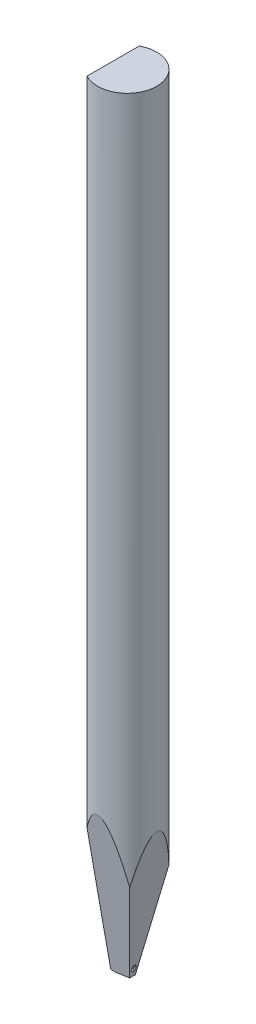
ISO-10303-21;
HEADER;
FILE_DESCRIPTION(('STEP AP214'),'2;1');
FILE_NAME('part.step','',(''),(''),'','','');
FILE_SCHEMA(('AUTOMOTIVE_DESIGN { 1 0 10303 214 1 1 1 1 }'));
ENDSEC;
DATA;
#1=APPLICATION_CONTEXT('core data for automotive mechanical design processes');
#2=APPLICATION_PROTOCOL_DEFINITION('international standard','automotive_design',2000,#1);
#3=PRODUCT_CONTEXT('',#1,'mechanical');
#4=PRODUCT('Part','Part','',(#3));
#5=PRODUCT_RELATED_PRODUCT_CATEGORY('part','',(#4));
#6=PRODUCT_DEFINITION_FORMATION('','',#4);
#7=PRODUCT_DEFINITION_CONTEXT('part definition',#1,'design');
#8=PRODUCT_DEFINITION('design','',#6,#7);
#9=PRODUCT_DEFINITION_SHAPE('','',#8);
#10=(LENGTH_UNIT() NAMED_UNIT(*) SI_UNIT(.MILLI.,.METRE.));
#11=(NAMED_UNIT(*) PLANE_ANGLE_UNIT() SI_UNIT($,.RADIAN.));
#12=(NAMED_UNIT(*) SI_UNIT($,.STERADIAN.) SOLID_ANGLE_UNIT());
#13=UNCERTAINTY_MEASURE_WITH_UNIT(LENGTH_MEASURE(1.E-05),#10,'distance_accuracy_value','');
#14=(GEOMETRIC_REPRESENTATION_CONTEXT(3) GLOBAL_UNCERTAINTY_ASSIGNED_CONTEXT((#13)) GLOBAL_UNIT_ASSIGNED_CONTEXT((#10,
#11,#12)) REPRESENTATION_CONTEXT('',''));
#15=CARTESIAN_POINT('',(0.,0.,0.));
#16=DIRECTION('',(0.,0.,1.));
#17=DIRECTION('',(1.,0.,0.));
#18=AXIS2_PLACEMENT_3D('',#15,#16,#17);
#19=CARTESIAN_POINT('',(26.8738719491216,0.,0.0635));
#20=DIRECTION('',(0.,-0.173648177666931,0.984807753012208));
#21=DIRECTION('',(0.,-0.984807753012208,-0.173648177666931));
#22=AXIS2_PLACEMENT_3D('',#19,#20,#21);
#23=PLANE('',#22);
#24=CARTESIAN_POINT('',(-0.34798,0.02794,0.0684265758409963));
#25=DIRECTION('',(0.,-0.173648177666931,0.984807753012208));
#26=DIRECTION('',(0.,-0.984807753012208,-0.173648177666931));
#27=AXIS2_PLACEMENT_3D('',#24,#25,#26);
#28=ELLIPSE('',#27,0.0283710195360877,0.02794);
#29=CARTESIAN_POINT('',(-0.34798,0.,0.0635000000000018));
#30=VERTEX_POINT('',#29);
#31=CARTESIAN_POINT('',(-0.37592,0.02794,0.0684265758409963));
#32=VERTEX_POINT('',#31);
#33=EDGE_CURVE('E427',#30,#32,#28,.F.);
#34=ORIENTED_EDGE('',*,*,#33,.F.);
#35=DIRECTION('',(-1.,0.,0.));
#36=VECTOR('',#35,1.);
#37=CARTESIAN_POINT('',(26.8738719491216,0.,0.0635));
#38=LINE('',#37,#36);
#39=CARTESIAN_POINT('',(-0.248919999999998,0.,0.0634999999999999));
#40=VERTEX_POINT('',#39);
#41=EDGE_CURVE('E327',#40,#30,#38,.T.);
#42=ORIENTED_EDGE('',*,*,#41,.F.);
#43=DIRECTION('',(-0.984346441568213,-0.173566836012845,-0.0306045161452665));
#44=VECTOR('',#43,1.);
#45=CARTESIAN_POINT('',(26.0313815351658,4.63392622180385,0.880586219516461));
#46=LINE('',#45,#44);
#47=CARTESIAN_POINT('',(0.144305865656663,0.0693363296277129,0.0757258656566614));
#48=VERTEX_POINT('',#47);
#49=EDGE_CURVE('E324',#48,#40,#46,.T.);
#50=ORIENTED_EDGE('',*,*,#49,.F.);
#51=DIRECTION('',(-0.171087869746036,-0.970287525247814,-0.171087869746036));
#52=VECTOR('',#51,1.);
#53=CARTESIAN_POINT('',(0.914840574567862,4.43925581566021,0.846260574567863));
#54=LINE('',#53,#52);
#55=CARTESIAN_POINT('',(0.593607862310868,2.61745457477063,0.525027862310868));
#56=VERTEX_POINT('',#55);
#57=EDGE_CURVE('E321',#56,#48,#54,.T.);
#58=ORIENTED_EDGE('',*,*,#57,.F.);
#59=CARTESIAN_POINT('',(0.,-0.36012639554572,0.));
#60=DIRECTION('',(0.,-0.173648177666931,0.984807753012208));
#61=DIRECTION('',(0.,-0.984807753012208,-0.173648177666931));
#62=AXIS2_PLACEMENT_3D('',#59,#60,#61);
#63=ELLIPSE('',#62,4.56371043248163,0.792479999999998);
#64=CARTESIAN_POINT('',(-0.37592,3.596415651605,0.69764511322018));
#65=VERTEX_POINT('',#64);
#66=EDGE_CURVE('E332',#56,#65,#63,.T.);
#67=ORIENTED_EDGE('',*,*,#66,.T.);
#68=DIRECTION('',(0.,0.984807753012208,0.173648177666931));
#69=VECTOR('',#68,1.);
#70=CARTESIAN_POINT('',(-0.37592,20.2489404246979,3.63393452763258));
#71=LINE('',#70,#69);
#72=EDGE_CURVE('E347',#32,#65,#71,.T.);
#73=ORIENTED_EDGE('',*,*,#72,.F.);
#74=EDGE_LOOP('',(#34,#42,#50,#58,#67,#73));
#75=FACE_BOUND('',#74,.T.);
#76=ADVANCED_FACE('F46',(#75),#23,.T.);
#77=CARTESIAN_POINT('',(26.8738719491216,0.,-0.0635));
#78=DIRECTION('',(0.,-0.173648177666931,-0.984807753012208));
#79=DIRECTION('',(0.,0.984807753012208,-0.173648177666931));
#80=AXIS2_PLACEMENT_3D('',#77,#78,#79);
#81=PLANE('',#80);
#82=CARTESIAN_POINT('',(-0.34798,0.02794,-0.0684265758409928));
#83=DIRECTION('',(0.,-0.173648177666931,-0.984807753012208));
#84=DIRECTION('',(0.,0.984807753012208,-0.173648177666931));
#85=AXIS2_PLACEMENT_3D('',#82,#83,#84);
#86=ELLIPSE('',#85,0.0283710195360877,0.02794);
#87=CARTESIAN_POINT('',(-0.37592,0.02794,-0.0684265758409928));
#88=VERTEX_POINT('',#87);
#89=CARTESIAN_POINT('',(-0.34798,0.,-0.0634999999999983));
#90=VERTEX_POINT('',#89);
#91=EDGE_CURVE('E432',#88,#90,#86,.F.);
#92=ORIENTED_EDGE('',*,*,#91,.F.);
#93=DIRECTION('',(0.,-0.984807753012208,0.173648177666931));
#94=VECTOR('',#93,1.);
#95=CARTESIAN_POINT('',(-0.37592,20.5234047424735,-3.68232999209816));
#96=LINE('',#95,#94);
#97=CARTESIAN_POINT('',(-0.37592,3.596415651605,-0.69764511322018));
#98=VERTEX_POINT('',#97);
#99=EDGE_CURVE('E349',#98,#88,#96,.T.);
#100=ORIENTED_EDGE('',*,*,#99,.F.);
#101=CARTESIAN_POINT('',(0.,-0.36012639554572,0.));
#102=DIRECTION('',(0.,-0.173648177666931,-0.984807753012208));
#103=DIRECTION('',(0.,-0.984807753012208,0.173648177666931));
#104=AXIS2_PLACEMENT_3D('',#101,#102,#103);
#105=ELLIPSE('',#104,4.56371043248163,0.792479999999998);
#106=CARTESIAN_POINT('',(0.593607862310868,2.61745457477063,-0.525027862310868));
#107=VERTEX_POINT('',#106);
#108=EDGE_CURVE('E335',#98,#107,#105,.T.);
#109=ORIENTED_EDGE('',*,*,#108,.T.);
#110=DIRECTION('',(0.171087869746036,0.970287525247814,-0.171087869746036));
#111=VECTOR('',#110,1.);
#112=CARTESIAN_POINT('',(0.914840574567862,4.43925581566021,-0.846260574567863));
#113=LINE('',#112,#111);
#114=CARTESIAN_POINT('',(0.144305865656663,0.0693363296277129,-0.0757258656566614));
#115=VERTEX_POINT('',#114);
#116=EDGE_CURVE('E352',#115,#107,#113,.T.);
#117=ORIENTED_EDGE('',*,*,#116,.F.);
#118=DIRECTION('',(0.984346441568213,0.173566836012845,-0.0306045161452665));
#119=VECTOR('',#118,1.);
#120=CARTESIAN_POINT('',(26.0313815351658,4.63392622180385,-0.880586219516461));
#121=LINE('',#120,#119);
#122=CARTESIAN_POINT('',(-0.248919999999998,0.,-0.0634999999999999));
#123=VERTEX_POINT('',#122);
#124=EDGE_CURVE('E354',#123,#115,#121,.T.);
#125=ORIENTED_EDGE('',*,*,#124,.F.);
#126=DIRECTION('',(-1.,0.,0.));
#127=VECTOR('',#126,1.);
#128=CARTESIAN_POINT('',(26.8738719491216,0.,-0.0635));
#129=LINE('',#128,#127);
#130=EDGE_CURVE('E329',#123,#90,#129,.T.);
#131=ORIENTED_EDGE('',*,*,#130,.T.);
#132=EDGE_LOOP('',(#92,#100,#109,#117,#125,#131));
#133=FACE_BOUND('',#132,.T.);
#134=ADVANCED_FACE('F243',(#133),#81,.T.);
#135=CARTESIAN_POINT('',(26.7151219491216,-0.192529968,0.));
#136=DIRECTION('',(-1.,0.,0.));
#137=DIRECTION('',(0.,0.,1.));
#138=AXIS2_PLACEMENT_3D('',#135,#136,#137);
#139=CYLINDRICAL_SURFACE('',#138,0.19558);
#140=DIRECTION('',(-1.,0.,0.));
#141=VECTOR('',#140,1.);
#142=CARTESIAN_POINT('',(26.7151219491216,0.,0.0344056364847241));
#143=LINE('',#142,#141);
#144=CARTESIAN_POINT('',(-0.24922431076338,0.,0.0344056364847241));
#145=VERTEX_POINT('',#144);
#146=CARTESIAN_POINT('',(-0.347980000000001,0.,0.0344056364847239));
#147=VERTEX_POINT('',#146);
#148=EDGE_CURVE('E208',#145,#147,#143,.T.);
#149=ORIENTED_EDGE('',*,*,#148,.T.);
#150=CARTESIAN_POINT('',(-0.34798,0.,0.0344056364847239));
#151=CARTESIAN_POINT('',(-0.348291993839737,-1.79966997567509E-07,0.0344065232334272));
#152=CARTESIAN_POINT('',(-0.348602758837007,5.21872086993922E-06,0.0343764392771758));
#153=CARTESIAN_POINT('',(-0.34921006356868,2.55061271704581E-05,0.0342626785365515));
#154=CARTESIAN_POINT('',(-0.349506734398268,4.02725998768661E-05,0.0341796920415573));
#155=CARTESIAN_POINT('',(-0.350150841128098,8.21489238627482E-05,0.0339429712564009));
#156=CARTESIAN_POINT('',(-0.350493595194685,0.000111357669117456,0.0337771137762689));
#157=CARTESIAN_POINT('',(-0.351148794413014,0.000178311741948302,0.0333930226458469));
#158=CARTESIAN_POINT('',(-0.351461068651474,0.000216101649977174,0.033174515094566));
#159=CARTESIAN_POINT('',(-0.352245670219596,0.000323128344517273,0.0325480129696601));
#160=CARTESIAN_POINT('',(-0.352691893764451,0.000396967772787416,0.0321084852966625));
#161=CARTESIAN_POINT('',(-0.353515464561834,0.000550655051100788,0.0311711336010425));
#162=CARTESIAN_POINT('',(-0.35389266253347,0.000630515408313367,0.0306731869629384));
#163=CARTESIAN_POINT('',(-0.354976677619809,0.00087955160700147,0.0290770242409085));
#164=CARTESIAN_POINT('',(-0.355592557352238,0.0010508421884967,0.0279181692062193));
#165=CARTESIAN_POINT('',(-0.356670581187195,0.00138028372922173,0.0255310848987606));
#166=CARTESIAN_POINT('',(-0.35713225892269,0.00153839376241503,0.0243026580847498));
#167=CARTESIAN_POINT('',(-0.358514413210691,0.00204019990402332,0.0200729731943519));
#168=CARTESIAN_POINT('',(-0.359179382525933,0.00233599742942756,0.0169833732346475));
#169=CARTESIAN_POINT('',(-0.360139638458901,0.00278053086917812,0.0107379776695384));
#170=CARTESIAN_POINT('',(-0.360433615147852,0.00292874529967909,0.00758198728859039));
#171=CARTESIAN_POINT('',(-0.360742249227645,0.00308403035415381,0.000698902805143698));
#172=CARTESIAN_POINT('',(-0.360699157567769,0.00306192985145626,-0.00303167014324849));
#173=CARTESIAN_POINT('',(-0.360188108604244,0.0028060165876571,-0.0104418963702988));
#174=CARTESIAN_POINT('',(-0.359722266512437,0.00257325786066388,-0.014121710654534));
#175=CARTESIAN_POINT('',(-0.358512283421268,0.00205682108199348,-0.0197938659859517));
#176=CARTESIAN_POINT('',(-0.357973258045608,0.00183782137117084,-0.0218329151073737));
#177=CARTESIAN_POINT('',(-0.356882671451862,0.00145300880231597,-0.0249700077965998));
#178=CARTESIAN_POINT('',(-0.356430992295293,0.00130335781815904,-0.0261043589762571));
#179=CARTESIAN_POINT('',(-0.355387704349856,0.000994219304245223,-0.0283043061810109));
#180=CARTESIAN_POINT('',(-0.354796777839313,0.000834782454229147,-0.0293702061793867));
#181=CARTESIAN_POINT('',(-0.353838016619572,0.000619743790301167,-0.0307388023218441));
#182=CARTESIAN_POINT('',(-0.353560222883085,0.000561274129126969,-0.0311036292481402));
#183=CARTESIAN_POINT('',(-0.35296747270226,0.000447073654707626,-0.0318044453597252));
#184=CARTESIAN_POINT('',(-0.352652422930163,0.000391350237100862,-0.0321403583193516));
#185=CARTESIAN_POINT('',(-0.351974715492417,0.000284889287858639,-0.0327730342592133));
#186=CARTESIAN_POINT('',(-0.351611428589594,0.000234236655208686,-0.0330691523657204));
#187=CARTESIAN_POINT('',(-0.350838568798108,0.000143922365646487,-0.0335913345782474));
#188=CARTESIAN_POINT('',(-0.350429385339002,0.000104176826330028,-0.0338179350089546));
#189=CARTESIAN_POINT('',(-0.349682077494717,5.0118594961954E-05,-0.0341242659637313));
#190=CARTESIAN_POINT('',(-0.349353910224046,3.18557522527509E-05,-0.0342270136639292));
#191=CARTESIAN_POINT('',(-0.348678008552955,6.56725534317226E-06,-0.0343689001650836));
#192=CARTESIAN_POINT('',(-0.348330033243962,-2.57638863813707E-07,-0.0344069027402337));
#193=CARTESIAN_POINT('',(-0.347980000219948,-5.13014559150288E-11,-0.0344056370116029));
#194=B_SPLINE_CURVE_WITH_KNOTS('',3,(#150,#151,#152,#153,#154,#155,#156,#157,#158,#159,#160,
#161,#162,#163,#164,#165,#166,#167,#168,#169,#170,#171,#172,#173,#174,#175,#176,#177,#178,#179,
#180,#181,#182,#183,#184,#185,#186,#187,#188,#189,#190,#191,#192,#193),.UNSPECIFIED.,.F.,.F.,(4,
2,2,2,2,2,2,2,2,2,2,2,2,2,2,2,2,2,2,2,2,4),(0.,0.000932508810228573,0.00185309227624895,
0.0029923597376098,0.00413768706483791,0.00601902553022539,0.00790438586328681,
0.0118526978152344,0.0158128451031081,0.0252834990058191,0.0347874998924775,0.0459513465532023,
0.0570596415605699,0.0634026197673819,0.0670879214003419,0.0707555282362808,0.0721405657368243,
0.073529149389654,0.0749380540247275,0.0763357985954979,0.0773626346370322,0.0784073119947524),.UNSPECIFIED.);
#195=CARTESIAN_POINT('',(-0.358915466306897,0.00223617218802553,0.0178187302528064));
#196=VERTEX_POINT('',#195);
#197=EDGE_CURVE('E206',#147,#196,#194,.T.);
#198=ORIENTED_EDGE('',*,*,#197,.T.);
#199=CARTESIAN_POINT('',(-0.37592,0.,-0.0344056364847241));
#200=CARTESIAN_POINT('',(-0.36321682990934,0.00202744708284551,-0.0230602767743972));
#201=CARTESIAN_POINT('',(-0.35052,0.003050032,-0.0115284862277323));
#202=CARTESIAN_POINT('',(-0.35052,0.003050032,0.0115284862277322));
#203=CARTESIAN_POINT('',(-0.363216829909341,0.0020274470828455,0.0230602767743973));
#204=CARTESIAN_POINT('',(-0.37592,0.,0.0344056364847241));
#205=(BOUNDED_CURVE() B_SPLINE_CURVE(3,(#199,#200,#201,#202,#203,#204),.UNSPECIFIED.,.F.,
.F.) B_SPLINE_CURVE_WITH_KNOTS((4,2,4),(1.39396020154298,1.5707963267949,1.74763245204681),
.UNSPECIFIED.) CURVE() GEOMETRIC_REPRESENTATION_ITEM() RATIONAL_B_SPLINE_CURVE((1.,1.,1.,1.,1.,1.)) REPRESENTATION_ITEM(''));
#206=CARTESIAN_POINT('',(-0.358929467303987,0.00223487413874506,-0.0178345991309213));
#207=VERTEX_POINT('',#206);
#208=EDGE_CURVE('E195',#196,#207,#205,.F.);
#209=ORIENTED_EDGE('',*,*,#208,.T.);
#210=CARTESIAN_POINT('',(-0.347980000000001,0.,-0.0344056364847239));
#211=VERTEX_POINT('',#210);
#212=EDGE_CURVE('E209',#207,#211,#194,.T.);
#213=ORIENTED_EDGE('',*,*,#212,.T.);
#214=DIRECTION('',(-1.,0.,0.));
#215=VECTOR('',#214,1.);
#216=CARTESIAN_POINT('',(26.7151219491216,0.,-0.034405636484724));
#217=LINE('',#216,#215);
#218=CARTESIAN_POINT('',(-0.24922431076338,0.,-0.034405636484724));
#219=VERTEX_POINT('',#218);
#220=EDGE_CURVE('E281',#219,#211,#217,.T.);
#221=ORIENTED_EDGE('',*,*,#220,.F.);
#222=CARTESIAN_POINT('',(-0.249224310763381,0.,-0.0344056364847272));
#223=CARTESIAN_POINT('',(-0.251265245513692,0.00015591730649852,-0.0335303011976263));
#224=CARTESIAN_POINT('',(-0.253236567155335,0.000336014453717128,-0.0324909079121602));
#225=CARTESIAN_POINT('',(-0.25698379671237,0.00072352868299271,-0.030102183331248));
#226=CARTESIAN_POINT('',(-0.258759296959103,0.00093100085546965,-0.0287522228545925));
#227=CARTESIAN_POINT('',(-0.262054353244596,0.00135198658208213,-0.0257602082717753));
#228=CARTESIAN_POINT('',(-0.263573197137213,0.00156551508635397,-0.0241173666119467));
#229=CARTESIAN_POINT('',(-0.266291813079521,0.00197164304030148,-0.0205865947475774));
#230=CARTESIAN_POINT('',(-0.267492010712882,0.00216427020026586,-0.0186989965092862));
#231=CARTESIAN_POINT('',(-0.269475334220563,0.00249507377987482,-0.0148426291652322));
#232=CARTESIAN_POINT('',(-0.270277671839548,0.00263565101455612,-0.0128839369199211));
#233=CARTESIAN_POINT('',(-0.271533243727163,0.00285993681419456,-0.00885378156277735));
#234=CARTESIAN_POINT('',(-0.271986410841034,0.00294363443932753,-0.0067822968399379));
#235=CARTESIAN_POINT('',(-0.272518765038473,0.00304233266407184,-0.00266506377782584));
#236=CARTESIAN_POINT('',(-0.27261061843031,0.00305965939008146,-0.000620998612609592));
#237=CARTESIAN_POINT('',(-0.272452629451527,0.00303015093454713,0.00345323280465665));
#238=CARTESIAN_POINT('',(-0.27220283159166,0.00298332411100662,0.00548340083261425));
#239=CARTESIAN_POINT('',(-0.27137265334511,0.00283138270163597,0.00945512049331916));
#240=CARTESIAN_POINT('',(-0.270795000220924,0.00272674916927972,0.0113972622206605));
#241=CARTESIAN_POINT('',(-0.269328904751492,0.00247098947414559,0.0151563247423955));
#242=CARTESIAN_POINT('',(-0.268440552540629,0.00231987679658515,0.0169732816703454));
#243=CARTESIAN_POINT('',(-0.266368991187115,0.00198552937614542,0.020453665701928));
#244=CARTESIAN_POINT('',(-0.265182712393853,0.00180196651192109,0.022115230572596));
#245=CARTESIAN_POINT('',(-0.262555851832215,0.00142297285319741,0.0252239838253788));
#246=CARTESIAN_POINT('',(-0.261115035994525,0.00122753124459652,0.0266709726134312));
#247=CARTESIAN_POINT('',(-0.25802271072488,0.000844528632223443,0.0293197711057559));
#248=CARTESIAN_POINT('',(-0.256371127202223,0.000656970430658437,0.0305214942043234));
#249=CARTESIAN_POINT('',(-0.252907096238624,0.000306276558369754,0.0326627490190229));
#250=CARTESIAN_POINT('',(-0.251094919946925,0.000143100925457761,0.0336027119846612));
#251=CARTESIAN_POINT('',(-0.249224310763386,0.,0.0344056364847213));
#252=B_SPLINE_CURVE_WITH_KNOTS('',3,(#222,#223,#224,#225,#226,#227,#228,#229,#230,#231,#232,
#233,#234,#235,#236,#237,#238,#239,#240,#241,#242,#243,#244,#245,#246,#247,#248,#249,#250,#251),
.UNSPECIFIED.,.F.,.F.,(4,2,2,2,2,2,2,2,2,2,2,2,2,2,4),(0.,0.00667534853800591,
0.0133643417163056,0.0200716005253063,0.0267698555389978,0.0331019733540908,0.0394353086997866,
0.0455445309233172,0.0516529573055346,0.0577113002609513,0.0637678871356571,0.0698896393996005,
0.0760170507409415,0.0821466220017616,0.0882660342390805),.UNSPECIFIED.);
#253=CARTESIAN_POINT('',(-0.272003262441945,0.00294692040371958,-0.00635));
#254=VERTEX_POINT('',#253);
#255=EDGE_CURVE('E252',#219,#254,#252,.T.);
#256=ORIENTED_EDGE('',*,*,#255,.T.);
#257=DIRECTION('',(-1.,0.,0.));
#258=VECTOR('',#257,1.);
#259=CARTESIAN_POINT('',(26.7151219491216,0.00294692040371896,-0.00635));
#260=LINE('',#259,#258);
#261=CARTESIAN_POINT('',(-0.286285889590485,0.00294692040372081,-0.00635));
#262=VERTEX_POINT('',#261);
#263=EDGE_CURVE('E366',#262,#254,#260,.F.);
#264=ORIENTED_EDGE('',*,*,#263,.F.);
#265=CARTESIAN_POINT('',(-0.823354226504969,-0.192529968,0.));
#266=DIRECTION('',(-0.342020143325664,0.93969262078591,0.));
#267=DIRECTION('',(-0.93969262078591,-0.342020143325664,0.));
#268=AXIS2_PLACEMENT_3D('',#265,#266,#267);
#269=ELLIPSE('',#268,0.571837664583905,0.19558);
#270=CARTESIAN_POINT('',(-0.286285889590485,0.00294692040372081,0.00635));
#271=VERTEX_POINT('',#270);
#272=EDGE_CURVE('E411',#262,#271,#269,.F.);
#273=ORIENTED_EDGE('',*,*,#272,.T.);
#274=DIRECTION('',(-1.,0.,0.));
#275=VECTOR('',#274,1.);
#276=CARTESIAN_POINT('',(26.7151219491216,0.00294692040371896,0.00635));
#277=LINE('',#276,#275);
#278=CARTESIAN_POINT('',(-0.272003262441945,0.00294692040371958,0.00635));
#279=VERTEX_POINT('',#278);
#280=EDGE_CURVE('E414',#271,#279,#277,.F.);
#281=ORIENTED_EDGE('',*,*,#280,.T.);
#282=EDGE_CURVE('E356',#279,#145,#252,.T.);
#283=ORIENTED_EDGE('',*,*,#282,.T.);
#284=EDGE_LOOP('',(#149,#198,#209,#213,#221,#256,#264,#273,#281,#283));
#285=FACE_BOUND('',#284,.T.);
#286=ADVANCED_FACE('F207',(#285),#139,.F.);
#287=CARTESIAN_POINT('',(-0.171667122138084,0.1016,0.));
#288=DIRECTION('',(-0.500000000000004,-0.866025403784436,0.));
#289=DIRECTION('',(0.866025403784436,-0.500000000000004,0.));
#290=AXIS2_PLACEMENT_3D('',#287,#288,#289);
#291=CYLINDRICAL_SURFACE('',#290,0.0381);
#292=DIRECTION('',(-0.500000000000004,-0.866025403784436,0.));
#293=VECTOR('',#292,1.);
#294=CARTESIAN_POINT('',(-0.204201190820005,0.120383553311342,-0.00635));
#295=LINE('',#294,#293);
#296=CARTESIAN_POINT('',(-0.268982486856643,0.00817905719572605,-0.00635));
#297=VERTEX_POINT('',#296);
#298=EDGE_CURVE('E202',#254,#297,#295,.F.);
#299=ORIENTED_EDGE('',*,*,#298,.F.);
#300=ORIENTED_EDGE('',*,*,#255,.F.);
#301=CARTESIAN_POINT('',(-0.230325909487751,0.,0.));
#302=DIRECTION('',(0.,1.,0.));
#303=DIRECTION('',(-1.,0.,0.));
#304=AXIS2_PLACEMENT_3D('',#301,#302,#303);
#305=ELLIPSE('',#304,0.0439940905122496,0.0381);
#306=CARTESIAN_POINT('',(-0.24892,0.,-0.0344677020279305));
#307=VERTEX_POINT('',#306);
#308=EDGE_CURVE('E369',#219,#307,#305,.F.);
#309=ORIENTED_EDGE('',*,*,#308,.T.);
#310=CARTESIAN_POINT('',(-0.228218440422588,0.00365024349624154,0.));
#311=DIRECTION('',(-0.173648177666931,0.984807753012208,0.));
#312=DIRECTION('',(-0.984807753012208,-0.173648177666931,0.));
#313=AXIS2_PLACEMENT_3D('',#310,#311,#312);
#314=ELLIPSE('',#313,0.04973601772356,0.0381);
#315=CARTESIAN_POINT('',(-0.228218440422588,0.00365024349624153,-0.0380999999999996));
#316=VERTEX_POINT('',#315);
#317=EDGE_CURVE('E298',#316,#307,#314,.T.);
#318=ORIENTED_EDGE('',*,*,#317,.F.);
#319=DIRECTION('',(0.500000000000004,0.866025403784436,0.));
#320=VECTOR('',#319,1.);
#321=CARTESIAN_POINT('',(-0.171667122138084,0.1016,-0.0381));
#322=LINE('',#321,#320);
#323=CARTESIAN_POINT('',(-0.171667122138084,0.1016,-0.0381));
#324=VERTEX_POINT('',#323);
#325=EDGE_CURVE('E378',#316,#324,#322,.T.);
#326=ORIENTED_EDGE('',*,*,#325,.T.);
#327=CARTESIAN_POINT('',(-0.171667122138084,0.1016,0.));
#328=DIRECTION('',(0.,-1.,0.));
#329=DIRECTION('',(-1.,0.,0.));
#330=AXIS2_PLACEMENT_3D('',#327,#328,#329);
#331=ELLIPSE('',#330,0.0439940905122496,0.0381);
#332=CARTESIAN_POINT('',(-0.171667122138084,0.1016,0.0381));
#333=VERTEX_POINT('',#332);
#334=EDGE_CURVE('E376',#324,#333,#331,.F.);
#335=ORIENTED_EDGE('',*,*,#334,.T.);
#336=DIRECTION('',(-0.500000000000004,-0.866025403784436,0.));
#337=VECTOR('',#336,1.);
#338=CARTESIAN_POINT('',(-0.172744432115812,0.0997340443830741,0.0381));
#339=LINE('',#338,#337);
#340=CARTESIAN_POINT('',(-0.228218440422588,0.00365024349624154,0.0380999999999996));
#341=VERTEX_POINT('',#340);
#342=EDGE_CURVE('E389',#333,#341,#339,.T.);
#343=ORIENTED_EDGE('',*,*,#342,.T.);
#344=CARTESIAN_POINT('',(-0.24892,0.,0.0344677020279305));
#345=VERTEX_POINT('',#344);
#346=EDGE_CURVE('E294',#345,#341,#314,.T.);
#347=ORIENTED_EDGE('',*,*,#346,.F.);
#348=EDGE_CURVE('E375',#345,#145,#305,.F.);
#349=ORIENTED_EDGE('',*,*,#348,.T.);
#350=ORIENTED_EDGE('',*,*,#282,.F.);
#351=DIRECTION('',(-0.500000000000004,-0.866025403784436,0.));
#352=VECTOR('',#351,1.);
#353=CARTESIAN_POINT('',(-0.204201190820005,0.120383553311342,0.00635));
#354=LINE('',#353,#352);
#355=CARTESIAN_POINT('',(-0.268982486856643,0.0081790571957259,0.00635));
#356=VERTEX_POINT('',#355);
#357=EDGE_CURVE('E308',#279,#356,#354,.F.);
#358=ORIENTED_EDGE('',*,*,#357,.T.);
#359=CARTESIAN_POINT('',(-0.268982486856643,-0.0669551560496386,0.));
#360=DIRECTION('',(1.,0.,0.));
#361=DIRECTION('',(0.,-1.,0.));
#362=AXIS2_PLACEMENT_3D('',#359,#360,#361);
#363=ELLIPSE('',#362,0.0761999999999994,0.0381);
#364=CARTESIAN_POINT('',(-0.268982486856643,0.009244843950361,0.));
#365=VERTEX_POINT('',#364);
#366=EDGE_CURVE('E755',#356,#365,#363,.F.);
#367=ORIENTED_EDGE('',*,*,#366,.T.);
#368=EDGE_CURVE('E756',#365,#297,#363,.F.);
#369=ORIENTED_EDGE('',*,*,#368,.T.);
#370=EDGE_LOOP('',(#299,#300,#309,#318,#326,#335,#343,#347,#349,#350,#358,#367,#369));
#371=FACE_BOUND('',#370,.T.);
#372=ADVANCED_FACE('F242',(#371),#291,.F.);
#373=CARTESIAN_POINT('',(0.,0.,0.));
#374=DIRECTION('',(0.,1.,0.));
#375=DIRECTION('',(0.,0.,1.));
#376=AXIS2_PLACEMENT_3D('',#373,#374,#375);
#377=PLANE('',#376);
#378=ORIENTED_EDGE('',*,*,#41,.T.);
#379=DIRECTION('',(0.,0.,-1.));
#380=VECTOR('',#379,1.);
#381=CARTESIAN_POINT('',(-0.34798,0.,26.4535481526147));
#382=LINE('',#381,#380);
#383=EDGE_CURVE('E79',#30,#147,#382,.T.);
#384=ORIENTED_EDGE('',*,*,#383,.T.);
#385=ORIENTED_EDGE('',*,*,#148,.F.);
#386=ORIENTED_EDGE('',*,*,#348,.F.);
#387=DIRECTION('',(0.,0.,-1.));
#388=VECTOR('',#387,1.);
#389=CARTESIAN_POINT('',(-0.24892,0.,27.2760283406468));
#390=LINE('',#389,#388);
#391=EDGE_CURVE('E309',#40,#345,#390,.T.);
#392=ORIENTED_EDGE('',*,*,#391,.F.);
#393=EDGE_LOOP('',(#378,#384,#385,#386,#392));
#394=FACE_BOUND('',#393,.T.);
#395=ADVANCED_FACE('F458',(#394),#377,.F.);
#396=ORIENTED_EDGE('',*,*,#220,.T.);
#397=EDGE_CURVE('E435',#211,#90,#382,.T.);
#398=ORIENTED_EDGE('',*,*,#397,.T.);
#399=ORIENTED_EDGE('',*,*,#130,.F.);
#400=EDGE_CURVE('E290',#307,#123,#390,.T.);
#401=ORIENTED_EDGE('',*,*,#400,.F.);
#402=ORIENTED_EDGE('',*,*,#308,.F.);
#403=EDGE_LOOP('',(#396,#398,#399,#401,#402));
#404=FACE_BOUND('',#403,.T.);
#405=ADVANCED_FACE('F372',(#404),#377,.F.);
#406=CARTESIAN_POINT('',(0.,21.0312,0.));
#407=DIRECTION('',(0.,-1.,0.));
#408=DIRECTION('',(0.,0.,-1.));
#409=AXIS2_PLACEMENT_3D('',#406,#407,#408);
#410=CYLINDRICAL_SURFACE('',#409,0.792479999999998);
#411=ORIENTED_EDGE('',*,*,#66,.F.);
#412=CARTESIAN_POINT('',(0.,-0.749062902735107,0.));
#413=DIRECTION('',(-0.984807753012208,0.173648177666931,0.));
#414=DIRECTION('',(-0.173648177666931,-0.984807753012208,0.));
#415=AXIS2_PLACEMENT_3D('',#412,#413,#414);
#416=ELLIPSE('',#415,4.56371043248165,0.792479999999998);
#417=EDGE_CURVE('E313',#56,#107,#416,.T.);
#418=ORIENTED_EDGE('',*,*,#417,.T.);
#419=ORIENTED_EDGE('',*,*,#108,.F.);
#420=DIRECTION('',(0.,-1.,0.));
#421=VECTOR('',#420,1.);
#422=CARTESIAN_POINT('',(-0.37592,21.0312,-0.69764511322018));
#423=LINE('',#422,#421);
#424=CARTESIAN_POINT('',(-0.37592,21.0312,-0.69764511322018));
#425=VERTEX_POINT('',#424);
#426=EDGE_CURVE('E341',#425,#98,#423,.T.);
#427=ORIENTED_EDGE('',*,*,#426,.F.);
#428=CARTESIAN_POINT('',(0.,21.0312,0.));
#429=DIRECTION('',(0.,1.,0.));
#430=DIRECTION('',(0.,0.,1.));
#431=AXIS2_PLACEMENT_3D('',#428,#429,#430);
#432=CIRCLE('',#431,0.792479999999998);
#433=CARTESIAN_POINT('',(-0.37592,21.0312,0.69764511322018));
#434=VERTEX_POINT('',#433);
#435=EDGE_CURVE('E344',#434,#425,#432,.T.);
#436=ORIENTED_EDGE('',*,*,#435,.F.);
#437=DIRECTION('',(0.,-1.,0.));
#438=VECTOR('',#437,1.);
#439=CARTESIAN_POINT('',(-0.37592,21.0312,0.69764511322018));
#440=LINE('',#439,#438);
#441=EDGE_CURVE('E339',#65,#434,#440,.F.);
#442=ORIENTED_EDGE('',*,*,#441,.F.);
#443=EDGE_LOOP('',(#411,#418,#419,#427,#436,#442));
#444=FACE_BOUND('',#443,.T.);
#445=ADVANCED_FACE('F450',(#444),#410,.T.);
#446=CARTESIAN_POINT('',(-0.37592,21.0312,-0.80247998));
#447=DIRECTION('',(-1.,0.,0.));
#448=DIRECTION('',(0.,0.,1.));
#449=AXIS2_PLACEMENT_3D('',#446,#447,#448);
#450=PLANE('',#449);
#451=DIRECTION('',(0.,0.,-1.));
#452=VECTOR('',#451,1.);
#453=CARTESIAN_POINT('',(-0.37592,0.02794,26.4535481526147));
#454=LINE('',#453,#452);
#455=CARTESIAN_POINT('',(-0.37592,0.02794,0.000946266783928687));
#456=VERTEX_POINT('',#455);
#457=EDGE_CURVE('E71',#32,#456,#454,.T.);
#458=ORIENTED_EDGE('',*,*,#457,.F.);
#459=ORIENTED_EDGE('',*,*,#72,.T.);
#460=ORIENTED_EDGE('',*,*,#441,.T.);
#461=DIRECTION('',(0.,0.,-1.));
#462=VECTOR('',#461,1.);
#463=CARTESIAN_POINT('',(-0.37592,21.0312,-0.80247998));
#464=LINE('',#463,#462);
#465=EDGE_CURVE('E337',#434,#425,#464,.T.);
#466=ORIENTED_EDGE('',*,*,#465,.T.);
#467=ORIENTED_EDGE('',*,*,#426,.T.);
#468=ORIENTED_EDGE('',*,*,#99,.T.);
#469=EDGE_CURVE('E437',#456,#88,#454,.T.);
#470=ORIENTED_EDGE('',*,*,#469,.F.);
#471=EDGE_LOOP('',(#458,#459,#460,#466,#467,#468,#470));
#472=FACE_BOUND('',#471,.T.);
#473=ADVANCED_FACE('F443',(#472),#450,.T.);
#474=CARTESIAN_POINT('',(0.,21.0312,0.));
#475=DIRECTION('',(0.,1.,0.));
#476=DIRECTION('',(0.,0.,1.));
#477=AXIS2_PLACEMENT_3D('',#474,#475,#476);
#478=PLANE('',#477);
#479=ORIENTED_EDGE('',*,*,#435,.T.);
#480=ORIENTED_EDGE('',*,*,#465,.F.);
#481=EDGE_LOOP('',(#479,#480));
#482=FACE_BOUND('',#481,.T.);
#483=ADVANCED_FACE('F505',(#482),#478,.T.);
#484=CARTESIAN_POINT('',(-0.24892,0.,27.2760283406468));
#485=DIRECTION('',(-0.173648177666931,0.984807753012208,0.));
#486=DIRECTION('',(-0.984807753012208,-0.173648177666931,0.));
#487=AXIS2_PLACEMENT_3D('',#484,#485,#486);
#488=PLANE('',#487);
#489=ORIENTED_EDGE('',*,*,#391,.T.);
#490=ORIENTED_EDGE('',*,*,#346,.T.);
#491=DIRECTION('',(-0.984807753012208,-0.173648177666931,0.));
#492=VECTOR('',#491,1.);
#493=CARTESIAN_POINT('',(-0.24892,0.,0.0380999999999992));
#494=LINE('',#493,#492);
#495=CARTESIAN_POINT('',(-0.0711200000000001,0.0313509371699652,0.0380999999999996));
#496=VERTEX_POINT('',#495);
#497=EDGE_CURVE('E306',#496,#341,#494,.T.);
#498=ORIENTED_EDGE('',*,*,#497,.F.);
#499=DIRECTION('',(0.,0.,1.));
#500=VECTOR('',#499,1.);
#501=CARTESIAN_POINT('',(-0.0711200000000001,0.0313509371699652,27.2760283406468));
#502=LINE('',#501,#500);
#503=CARTESIAN_POINT('',(-0.0711200000000001,0.0313509371699652,-0.0380999999999996));
#504=VERTEX_POINT('',#503);
#505=EDGE_CURVE('E304',#504,#496,#502,.T.);
#506=ORIENTED_EDGE('',*,*,#505,.F.);
#507=DIRECTION('',(-0.984807753012208,-0.173648177666931,0.));
#508=VECTOR('',#507,1.);
#509=CARTESIAN_POINT('',(-0.24892,0.,-0.0380999999999992));
#510=LINE('',#509,#508);
#511=EDGE_CURVE('E301',#504,#316,#510,.T.);
#512=ORIENTED_EDGE('',*,*,#511,.T.);
#513=ORIENTED_EDGE('',*,*,#317,.T.);
#514=ORIENTED_EDGE('',*,*,#400,.T.);
#515=ORIENTED_EDGE('',*,*,#124,.T.);
#516=DIRECTION('',(0.,0.,-1.));
#517=VECTOR('',#516,1.);
#518=CARTESIAN_POINT('',(0.144305865656661,0.0693363296277119,27.2760283406468));
#519=LINE('',#518,#517);
#520=EDGE_CURVE('E283',#48,#115,#519,.T.);
#521=ORIENTED_EDGE('',*,*,#520,.F.);
#522=ORIENTED_EDGE('',*,*,#49,.T.);
#523=EDGE_LOOP('',(#489,#490,#498,#506,#512,#513,#514,#515,#521,#522));
#524=FACE_BOUND('',#523,.T.);
#525=ADVANCED_FACE('F455',(#524),#488,.F.);
#526=CARTESIAN_POINT('',(0.144305865656661,0.0693363296277119,27.2760283406468));
#527=DIRECTION('',(-0.984807753012208,0.173648177666931,0.));
#528=DIRECTION('',(-0.173648177666931,-0.984807753012208,0.));
#529=AXIS2_PLACEMENT_3D('',#526,#527,#528);
#530=PLANE('',#529);
#531=CARTESIAN_POINT('',(0.180009189299949,0.271819939905814,0.));
#532=DIRECTION('',(-0.984807753012208,0.173648177666931,0.));
#533=DIRECTION('',(0.173648177666931,0.984807753012208,0.));
#534=AXIS2_PLACEMENT_3D('',#531,#532,#533);
#535=ELLIPSE('',#534,0.082066054859405,0.0589468715440827);
#536=CARTESIAN_POINT('',(0.194259810174599,0.352639226990481,0.));
#537=VERTEX_POINT('',#536);
#538=EDGE_CURVE('E292',#537,#537,#535,.F.);
#539=ORIENTED_EDGE('',*,*,#538,.F.);
#540=EDGE_LOOP('',(#539));
#541=FACE_BOUND('',#540,.T.);
#542=ORIENTED_EDGE('',*,*,#417,.F.);
#543=ORIENTED_EDGE('',*,*,#57,.T.);
#544=ORIENTED_EDGE('',*,*,#520,.T.);
#545=ORIENTED_EDGE('',*,*,#116,.T.);
#546=EDGE_LOOP('',(#542,#543,#544,#545));
#547=FACE_BOUND('',#546,.T.);
#548=ADVANCED_FACE('F247',(#541,#547),#530,.F.);
#549=CARTESIAN_POINT('',(-0.0711200000000001,0.1016,0.0381));
#550=DIRECTION('',(-1.,0.,0.));
#551=DIRECTION('',(0.,0.,1.));
#552=AXIS2_PLACEMENT_3D('',#549,#550,#551);
#553=PLANE('',#552);
#554=ORIENTED_EDGE('',*,*,#505,.T.);
#555=DIRECTION('',(0.,1.,0.));
#556=VECTOR('',#555,1.);
#557=CARTESIAN_POINT('',(-0.0711200000000001,0.1016,0.0381));
#558=LINE('',#557,#556);
#559=CARTESIAN_POINT('',(-0.0711200000000001,0.1016,0.0381));
#560=VERTEX_POINT('',#559);
#561=EDGE_CURVE('E392',#496,#560,#558,.T.);
#562=ORIENTED_EDGE('',*,*,#561,.T.);
#563=CARTESIAN_POINT('',(-0.0711200000000001,0.1016,0.));
#564=DIRECTION('',(1.,0.,0.));
#565=DIRECTION('',(0.,1.,0.));
#566=AXIS2_PLACEMENT_3D('',#563,#564,#565);
#567=ELLIPSE('',#566,0.0439940905122494,0.0381);
#568=CARTESIAN_POINT('',(-0.0711200000000001,0.1016,-0.0380999999999992));
#569=VERTEX_POINT('',#568);
#570=EDGE_CURVE('E399',#569,#560,#567,.F.);
#571=ORIENTED_EDGE('',*,*,#570,.F.);
#572=DIRECTION('',(0.,1.,0.));
#573=VECTOR('',#572,1.);
#574=CARTESIAN_POINT('',(-0.0711200000000001,0.1016,-0.0381));
#575=LINE('',#574,#573);
#576=EDGE_CURVE('E393',#504,#569,#575,.T.);
#577=ORIENTED_EDGE('',*,*,#576,.F.);
#578=EDGE_LOOP('',(#554,#562,#571,#577));
#579=FACE_BOUND('',#578,.T.);
#580=ADVANCED_FACE('F471',(#579),#553,.T.);
#581=CARTESIAN_POINT('',(0.,0.,0.0381));
#582=DIRECTION('',(0.,0.,-1.));
#583=DIRECTION('',(-1.,0.,0.));
#584=AXIS2_PLACEMENT_3D('',#581,#582,#583);
#585=PLANE('',#584);
#586=ORIENTED_EDGE('',*,*,#497,.T.);
#587=ORIENTED_EDGE('',*,*,#342,.F.);
#588=DIRECTION('',(-1.,0.,0.));
#589=VECTOR('',#588,1.);
#590=CARTESIAN_POINT('',(-0.215661212650333,0.1016,0.0381));
#591=LINE('',#590,#589);
#592=EDGE_CURVE('E395',#560,#333,#591,.T.);
#593=ORIENTED_EDGE('',*,*,#592,.F.);
#594=ORIENTED_EDGE('',*,*,#561,.F.);
#595=EDGE_LOOP('',(#586,#587,#593,#594));
#596=FACE_BOUND('',#595,.T.);
#597=ADVANCED_FACE('F466',(#596),#585,.T.);
#598=CARTESIAN_POINT('',(0.,0.,-0.0381));
#599=DIRECTION('',(0.,0.,-1.));
#600=DIRECTION('',(-1.,0.,0.));
#601=AXIS2_PLACEMENT_3D('',#598,#599,#600);
#602=PLANE('',#601);
#603=ORIENTED_EDGE('',*,*,#576,.T.);
#604=DIRECTION('',(-1.,0.,0.));
#605=VECTOR('',#604,1.);
#606=CARTESIAN_POINT('',(-0.215661212650333,0.1016,-0.0381));
#607=LINE('',#606,#605);
#608=EDGE_CURVE('E396',#569,#324,#607,.T.);
#609=ORIENTED_EDGE('',*,*,#608,.T.);
#610=ORIENTED_EDGE('',*,*,#325,.F.);
#611=ORIENTED_EDGE('',*,*,#511,.F.);
#612=EDGE_LOOP('',(#603,#609,#610,#611));
#613=FACE_BOUND('',#612,.T.);
#614=ADVANCED_FACE('F487',(#613),#602,.F.);
#615=CARTESIAN_POINT('',(0.13915375858163,0.223001611120617,0.));
#616=DIRECTION('',(0.866025403784441,0.499999999999995,0.));
#617=DIRECTION('',(-0.499999999999995,0.866025403784441,0.));
#618=AXIS2_PLACEMENT_3D('',#615,#616,#617);
#619=CONICAL_SURFACE('',#618,0.0381,0.392699081698725);
#620=CARTESIAN_POINT('',(0.13915375858163,0.223001611120617,0.));
#621=DIRECTION('',(0.866025403784441,0.499999999999995,0.));
#622=DIRECTION('',(-0.499999999999995,0.866025403784441,0.));
#623=AXIS2_PLACEMENT_3D('',#620,#621,#622);
#624=CIRCLE('',#623,0.0381);
#625=CARTESIAN_POINT('',(0.12010375858163,0.255997179004804,0.));
#626=VERTEX_POINT('',#625);
#627=EDGE_CURVE('E408',#626,#626,#624,.T.);
#628=ORIENTED_EDGE('',*,*,#627,.F.);
#629=EDGE_LOOP('',(#628));
#630=FACE_BOUND('',#629,.T.);
#631=ORIENTED_EDGE('',*,*,#538,.T.);
#632=EDGE_LOOP('',(#631));
#633=FACE_BOUND('',#632,.T.);
#634=ADVANCED_FACE('F485',(#630,#633),#619,.F.);
#635=CARTESIAN_POINT('',(-0.215661212650333,0.1016,0.0381));
#636=DIRECTION('',(0.,-1.,0.));
#637=DIRECTION('',(0.,0.,-1.));
#638=AXIS2_PLACEMENT_3D('',#635,#636,#637);
#639=PLANE('',#638);
#640=ORIENTED_EDGE('',*,*,#608,.F.);
#641=CARTESIAN_POINT('',(-0.0711200000000001,0.1016,0.));
#642=DIRECTION('',(0.,1.,0.));
#643=DIRECTION('',(1.,0.,0.));
#644=AXIS2_PLACEMENT_3D('',#641,#642,#643);
#645=ELLIPSE('',#644,0.0762000000000008,0.0381);
#646=EDGE_CURVE('E405',#560,#569,#645,.F.);
#647=ORIENTED_EDGE('',*,*,#646,.F.);
#648=ORIENTED_EDGE('',*,*,#592,.T.);
#649=ORIENTED_EDGE('',*,*,#334,.F.);
#650=EDGE_LOOP('',(#640,#647,#648,#649));
#651=FACE_BOUND('',#650,.T.);
#652=ADVANCED_FACE('F475',(#651),#639,.T.);
#653=CARTESIAN_POINT('',(-0.387084700849061,-0.0808223050896222,0.));
#654=DIRECTION('',(0.866025403784441,0.499999999999995,0.));
#655=DIRECTION('',(-0.499999999999995,0.866025403784441,0.));
#656=AXIS2_PLACEMENT_3D('',#653,#654,#655);
#657=CYLINDRICAL_SURFACE('',#656,0.0381);
#658=ORIENTED_EDGE('',*,*,#570,.T.);
#659=ORIENTED_EDGE('',*,*,#646,.T.);
#660=EDGE_LOOP('',(#658,#659));
#661=FACE_BOUND('',#660,.T.);
#662=ORIENTED_EDGE('',*,*,#627,.T.);
#663=EDGE_LOOP('',(#662));
#664=FACE_BOUND('',#663,.T.);
#665=ADVANCED_FACE('F478',(#661,#664),#657,.F.);
#666=CARTESIAN_POINT('',(-0.268982486856643,0.00924484395036097,-0.00635));
#667=DIRECTION('',(1.,0.,0.));
#668=DIRECTION('',(0.,0.,-1.));
#669=AXIS2_PLACEMENT_3D('',#666,#667,#668);
#670=PLANE('',#669);
#671=DIRECTION('',(0.,1.,0.));
#672=VECTOR('',#671,1.);
#673=CARTESIAN_POINT('',(-0.268982486856643,0.00924484395036097,0.00635));
#674=LINE('',#673,#672);
#675=CARTESIAN_POINT('',(-0.268982486856643,0.00924484395036097,0.00635));
#676=VERTEX_POINT('',#675);
#677=EDGE_CURVE('E424',#356,#676,#674,.T.);
#678=ORIENTED_EDGE('',*,*,#677,.T.);
#679=DIRECTION('',(0.,0.,1.));
#680=VECTOR('',#679,1.);
#681=CARTESIAN_POINT('',(-0.268982486856643,0.00924484395036097,-0.00635));
#682=LINE('',#681,#680);
#683=EDGE_CURVE('E419',#365,#676,#682,.T.);
#684=ORIENTED_EDGE('',*,*,#683,.F.);
#685=ORIENTED_EDGE('',*,*,#366,.F.);
#686=EDGE_LOOP('',(#678,#684,#685));
#687=FACE_BOUND('',#686,.T.);
#688=ADVANCED_FACE('F481',(#687),#670,.F.);
#689=CARTESIAN_POINT('',(-0.268982486856643,0.00924484395036097,-0.00635));
#690=VERTEX_POINT('',#689);
#691=EDGE_CURVE('E416',#690,#365,#682,.T.);
#692=ORIENTED_EDGE('',*,*,#691,.F.);
#693=DIRECTION('',(0.,1.,0.));
#694=VECTOR('',#693,1.);
#695=CARTESIAN_POINT('',(-0.268982486856643,0.00924484395036097,-0.00635));
#696=LINE('',#695,#694);
#697=EDGE_CURVE('E423',#297,#690,#696,.T.);
#698=ORIENTED_EDGE('',*,*,#697,.F.);
#699=ORIENTED_EDGE('',*,*,#368,.F.);
#700=EDGE_LOOP('',(#692,#698,#699));
#701=FACE_BOUND('',#700,.T.);
#702=ADVANCED_FACE('F591',(#701),#670,.F.);
#703=CARTESIAN_POINT('',(-0.268982486856643,0.00924484395036097,-0.00635));
#704=DIRECTION('',(-0.342020143325664,0.93969262078591,0.));
#705=DIRECTION('',(-0.93969262078591,-0.342020143325664,0.));
#706=AXIS2_PLACEMENT_3D('',#703,#704,#705);
#707=PLANE('',#706);
#708=DIRECTION('',(-0.93969262078591,-0.342020143325664,0.));
#709=VECTOR('',#708,1.);
#710=CARTESIAN_POINT('',(-0.268982486856643,0.00924484395036097,-0.00635));
#711=LINE('',#710,#709);
#712=EDGE_CURVE('E428',#690,#262,#711,.T.);
#713=ORIENTED_EDGE('',*,*,#712,.F.);
#714=ORIENTED_EDGE('',*,*,#691,.T.);
#715=ORIENTED_EDGE('',*,*,#683,.T.);
#716=DIRECTION('',(-0.93969262078591,-0.342020143325664,0.));
#717=VECTOR('',#716,1.);
#718=CARTESIAN_POINT('',(-0.268982486856643,0.00924484395036097,0.00635));
#719=LINE('',#718,#717);
#720=EDGE_CURVE('E420',#676,#271,#719,.T.);
#721=ORIENTED_EDGE('',*,*,#720,.T.);
#722=ORIENTED_EDGE('',*,*,#272,.F.);
#723=EDGE_LOOP('',(#713,#714,#715,#721,#722));
#724=FACE_BOUND('',#723,.T.);
#725=ADVANCED_FACE('F600',(#724),#707,.F.);
#726=CARTESIAN_POINT('',(0.,0.,-0.00635));
#727=DIRECTION('',(0.,0.,1.));
#728=DIRECTION('',(1.,0.,0.));
#729=AXIS2_PLACEMENT_3D('',#726,#727,#728);
#730=PLANE('',#729);
#731=ORIENTED_EDGE('',*,*,#263,.T.);
#732=ORIENTED_EDGE('',*,*,#298,.T.);
#733=ORIENTED_EDGE('',*,*,#697,.T.);
#734=ORIENTED_EDGE('',*,*,#712,.T.);
#735=EDGE_LOOP('',(#731,#732,#733,#734));
#736=FACE_BOUND('',#735,.T.);
#737=ADVANCED_FACE('F223',(#736),#730,.T.);
#738=CARTESIAN_POINT('',(0.,0.,0.00635));
#739=DIRECTION('',(0.,0.,1.));
#740=DIRECTION('',(1.,0.,0.));
#741=AXIS2_PLACEMENT_3D('',#738,#739,#740);
#742=PLANE('',#741);
#743=ORIENTED_EDGE('',*,*,#720,.F.);
#744=ORIENTED_EDGE('',*,*,#677,.F.);
#745=ORIENTED_EDGE('',*,*,#357,.F.);
#746=ORIENTED_EDGE('',*,*,#280,.F.);
#747=EDGE_LOOP('',(#743,#744,#745,#746));
#748=FACE_BOUND('',#747,.T.);
#749=ADVANCED_FACE('F618',(#748),#742,.F.);
#750=CARTESIAN_POINT('',(-0.37592,0.,0.0344056364847241));
#751=CARTESIAN_POINT('',(-0.363216829909341,0.0020274470828455,0.0230602767743973));
#752=CARTESIAN_POINT('',(-0.35052,0.003050032,0.0115284862277322));
#753=CARTESIAN_POINT('',(-0.35052,0.003050032,-0.0115284862277323));
#754=CARTESIAN_POINT('',(-0.36321682990934,0.00202744708284551,-0.0230602767743972));
#755=CARTESIAN_POINT('',(-0.37592,0.,-0.0344056364847241));
#756=CARTESIAN_POINT('',(-0.37592,0.,0.0344056364847241));
#757=CARTESIAN_POINT('',(-0.375919999999989,0.00202806137725615,0.0230568370640633));
#758=CARTESIAN_POINT('',(-0.375919999999999,0.00305003200000022,0.0115284862277325));
#759=CARTESIAN_POINT('',(-0.375919999999999,0.0030500320000001,-0.0115284862277324));
#760=CARTESIAN_POINT('',(-0.375919999999991,0.00202806137725417,-0.023056837064063));
#761=CARTESIAN_POINT('',(-0.37592,0.,-0.0344056364847241));
#762=CARTESIAN_POINT('',(-0.37592,0.,0.0344056364847241));
#763=CARTESIAN_POINT('',(-0.37592,0.0144116560088984,0.0253708990055392));
#764=CARTESIAN_POINT('',(-0.37592,0.0284500319999992,0.0130238328179267));
#765=CARTESIAN_POINT('',(-0.37592,0.0284500319999992,-0.0130238328179267));
#766=CARTESIAN_POINT('',(-0.37592,0.0144116560088978,-0.0253708990055382));
#767=CARTESIAN_POINT('',(-0.37592,0.,-0.0344056364847241));
#768=(BOUNDED_SURFACE() B_SPLINE_SURFACE(2,3,((#750,#751,#752,#753,#754,#755),(#756,#757,#758,
#759,#760,#761),(#762,#763,#764,#765,#766,#767)),.UNSPECIFIED.,.F.,.F.,
.F.) B_SPLINE_SURFACE_WITH_KNOTS((3,3),(4,2,4),(0.,1.),(1.39396020154298,1.5707963267949,
1.74763245204681),.UNSPECIFIED.) GEOMETRIC_REPRESENTATION_ITEM() RATIONAL_B_SPLINE_SURFACE(((1.,
1.,1.,1.,1.,1.),(0.707106781186548,0.707106781186548,0.707106781186561,0.707106781186561,
0.707106781186548,0.707106781186548),(1.,1.,1.,1.,1.,1.))) REPRESENTATION_ITEM('') SURFACE());
#769=CARTESIAN_POINT('',(-0.358928650306745,0.00223454033750358,-0.0178348874792161));
#770=CARTESIAN_POINT('',(-0.359090359572979,0.00230253299033808,-0.0170361261925254));
#771=CARTESIAN_POINT('',(-0.359388184239889,0.00243105937939743,-0.0162998944592659));
#772=CARTESIAN_POINT('',(-0.360266906201973,0.00284147076182529,-0.0147702721218663));
#773=CARTESIAN_POINT('',(-0.360902603008674,0.0031554488856011,-0.0140153470525582));
#774=CARTESIAN_POINT('',(-0.362708429222951,0.00416291421918242,-0.0122876899218021));
#775=CARTESIAN_POINT('',(-0.363959464171017,0.004970619824464,-0.0114867819181524));
#776=CARTESIAN_POINT('',(-0.367227364202614,0.00751713689430282,-0.00964022965253212));
#777=CARTESIAN_POINT('',(-0.369159708847045,0.0095103758423648,-0.00882245067536845));
#778=CARTESIAN_POINT('',(-0.372432352150201,0.0141158124362954,-0.00736951609771311));
#779=CARTESIAN_POINT('',(-0.373745528874069,0.0167497929375253,-0.00674308964325026));
#780=CARTESIAN_POINT('',(-0.375228501249927,0.021441850310557,-0.00572310401492781));
#781=CARTESIAN_POINT('',(-0.375625745094421,0.0234278724345049,-0.00531718321330195));
#782=CARTESIAN_POINT('',(-0.375882529135687,0.0262638349365375,-0.00471654682933348));
#783=CARTESIAN_POINT('',(-0.375920430129537,0.0271026773351758,-0.00453631251087396));
#784=CARTESIAN_POINT('',(-0.37592,0.0279399999999994,-0.00435088708087756));
#785=B_SPLINE_CURVE_WITH_KNOTS('',3,(#769,#770,#771,#772,#773,#774,#775,#776,#777,#778,#779,
#780,#781,#782,#783,#784),.UNSPECIFIED.,.F.,.F.,(4,2,2,2,2,2,2,4),(0.,0.00239520544253599,
0.00543871225936133,0.0104381869949316,0.0189754465393851,0.0278581747502993,0.0340087342078035,
0.0365818446879007),.UNSPECIFIED.);
#786=EDGE_CURVE('E12',#207,#456,#785,.T.);
#787=CARTESIAN_POINT('',(-0.358928650306763,0.0022345403375059,0.0178348874792392));
#788=CARTESIAN_POINT('',(-0.359090359578564,0.0023025329801686,0.0170361261926339));
#789=CARTESIAN_POINT('',(-0.359388184243906,0.00243105937200169,0.0162998944593461));
#790=CARTESIAN_POINT('',(-0.36026690619749,0.00284147077032814,0.0147702721214718));
#791=CARTESIAN_POINT('',(-0.360902602995974,0.00315544890986134,0.014015347051745));
#792=CARTESIAN_POINT('',(-0.362708429203933,0.00416291425477913,0.0122876899215733));
#793=CARTESIAN_POINT('',(-0.363959464164435,0.00497061983621837,0.0114867819183023));
#794=CARTESIAN_POINT('',(-0.367227364212608,0.00751713687325727,0.00964022965298686));
#795=CARTESIAN_POINT('',(-0.369159708847916,0.00951037583458764,0.00882245067626987));
#796=CARTESIAN_POINT('',(-0.372432352144574,0.0141158124376635,0.00736951609890311));
#797=CARTESIAN_POINT('',(-0.373745528871327,0.0167497929341856,0.00674308964433347));
#798=CARTESIAN_POINT('',(-0.375228501249646,0.0214418503059716,0.00572310401567837));
#799=CARTESIAN_POINT('',(-0.375625745094281,0.0234278724318694,0.0053171832137923));
#800=CARTESIAN_POINT('',(-0.375882529135595,0.0262638349359688,0.00471654682947701));
#801=CARTESIAN_POINT('',(-0.375920430129449,0.0271026773349893,0.00453631251094933));
#802=CARTESIAN_POINT('',(-0.37592,0.0279400000000006,0.00435088708087856));
#803=B_SPLINE_CURVE_WITH_KNOTS('',3,(#787,#788,#789,#790,#791,#792,#793,#794,#795,#796,#797,
#798,#799,#800,#801,#802),.UNSPECIFIED.,.F.,.F.,(4,2,2,2,2,2,2,4),(0.,0.00239520544256349,
0.00543871226039691,0.0104381869907023,0.0189754465319619,0.0278581747421788,0.0340087342039229,
0.0365818446850544),.UNSPECIFIED.);
#804=EDGE_CURVE('E64',#456,#196,#803,.F.);
#805=ORIENTED_EDGE('',*,*,#786,.F.);
#806=ORIENTED_EDGE('',*,*,#208,.F.);
#807=ORIENTED_EDGE('',*,*,#804,.F.);
#808=EDGE_LOOP('',(#805,#806,#807));
#809=FACE_BOUND('',#808,.T.);
#810=ADVANCED_FACE('F49',(#809),#768,.T.);
#811=CARTESIAN_POINT('',(-0.34798,0.02794,26.4535481526147));
#812=DIRECTION('',(0.,0.,-1.));
#813=DIRECTION('',(-1.,0.,0.));
#814=AXIS2_PLACEMENT_3D('',#811,#812,#813);
#815=CYLINDRICAL_SURFACE('',#814,0.02794);
#816=ORIENTED_EDGE('',*,*,#383,.F.);
#817=ORIENTED_EDGE('',*,*,#33,.T.);
#818=ORIENTED_EDGE('',*,*,#457,.T.);
#819=ORIENTED_EDGE('',*,*,#804,.T.);
#820=ORIENTED_EDGE('',*,*,#197,.F.);
#821=EDGE_LOOP('',(#816,#817,#818,#819,#820));
#822=FACE_BOUND('',#821,.T.);
#823=ADVANCED_FACE('F211',(#822),#815,.T.);
#824=ORIENTED_EDGE('',*,*,#469,.T.);
#825=ORIENTED_EDGE('',*,*,#91,.T.);
#826=ORIENTED_EDGE('',*,*,#397,.F.);
#827=ORIENTED_EDGE('',*,*,#212,.F.);
#828=ORIENTED_EDGE('',*,*,#786,.T.);
#829=EDGE_LOOP('',(#824,#825,#826,#827,#828));
#830=FACE_BOUND('',#829,.T.);
#831=ADVANCED_FACE('F218',(#830),#815,.T.);
#832=CLOSED_SHELL('',(#76,#134,#286,#372,#395,#405,#445,#473,#483,#525,#548,#580,#597,#614,#634,
#652,#665,#688,#702,#725,#737,#749,#810,#823,#831));
#833=MANIFOLD_SOLID_BREP('B2',#832);
#834=ADVANCED_BREP_SHAPE_REPRESENTATION('',(#18,#833),#14);
#835=SHAPE_DEFINITION_REPRESENTATION(#9,#834);
ENDSEC;
END-ISO-10303-21;
